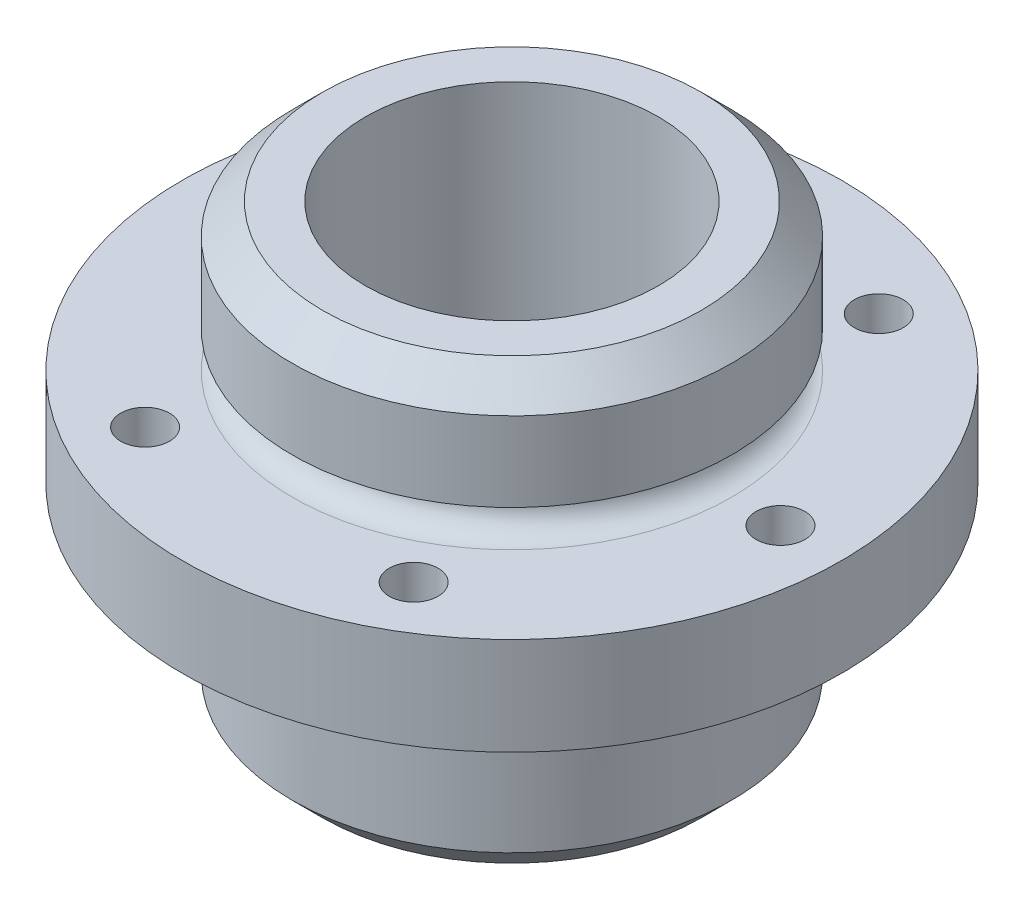
ISO-10303-21;
HEADER;
FILE_DESCRIPTION(('STEP AP214'),'2;1');
FILE_NAME('part.step','',(''),(''),'','','');
FILE_SCHEMA(('AUTOMOTIVE_DESIGN { 1 0 10303 214 1 1 1 1 }'));
ENDSEC;
DATA;
#1=APPLICATION_CONTEXT('core data for automotive mechanical design processes');
#2=APPLICATION_PROTOCOL_DEFINITION('international standard','automotive_design',2000,#1);
#3=PRODUCT_CONTEXT('',#1,'mechanical');
#4=PRODUCT('Part','Part','',(#3));
#5=PRODUCT_RELATED_PRODUCT_CATEGORY('part','',(#4));
#6=PRODUCT_DEFINITION_FORMATION('','',#4);
#7=PRODUCT_DEFINITION_CONTEXT('part definition',#1,'design');
#8=PRODUCT_DEFINITION('design','',#6,#7);
#9=PRODUCT_DEFINITION_SHAPE('','',#8);
#10=(LENGTH_UNIT() NAMED_UNIT(*) SI_UNIT(.MILLI.,.METRE.));
#11=(NAMED_UNIT(*) PLANE_ANGLE_UNIT() SI_UNIT($,.RADIAN.));
#12=(NAMED_UNIT(*) SI_UNIT($,.STERADIAN.) SOLID_ANGLE_UNIT());
#13=UNCERTAINTY_MEASURE_WITH_UNIT(LENGTH_MEASURE(1.E-05),#10,'distance_accuracy_value','');
#14=(GEOMETRIC_REPRESENTATION_CONTEXT(3) GLOBAL_UNCERTAINTY_ASSIGNED_CONTEXT((#13)) GLOBAL_UNIT_ASSIGNED_CONTEXT((#10,
#11,#12)) REPRESENTATION_CONTEXT('',''));
#15=CARTESIAN_POINT('',(0.,0.,0.));
#16=DIRECTION('',(0.,0.,1.));
#17=DIRECTION('',(1.,0.,0.));
#18=AXIS2_PLACEMENT_3D('',#15,#16,#17);
#19=CARTESIAN_POINT('',(0.,-8.39184523840261,0.));
#20=DIRECTION('',(0.,-1.,0.));
#21=DIRECTION('',(0.,0.,-1.));
#22=AXIS2_PLACEMENT_3D('',#19,#20,#21);
#23=TOROIDAL_SURFACE('',#22,35.3300603074002,4.);
#24=CARTESIAN_POINT('',(0.,-6.17583568312595,0.));
#25=DIRECTION('',(0.,-1.,0.));
#26=DIRECTION('',(0.,0.,-1.));
#27=AXIS2_PLACEMENT_3D('',#24,#25,#26);
#28=CIRCLE('',#27,32.);
#29=CARTESIAN_POINT('',(0.,-6.17583568312595,-32.));
#30=VERTEX_POINT('',#29);
#31=EDGE_CURVE('E93',#30,#30,#28,.T.);
#32=ORIENTED_EDGE('',*,*,#31,.T.);
#33=EDGE_LOOP('',(#32));
#34=FACE_BOUND('',#33,.T.);
#35=CARTESIAN_POINT('',(0.,-12.335343787696,0.));
#36=DIRECTION('',(0.,-1.,0.));
#37=DIRECTION('',(0.,0.,-1.));
#38=AXIS2_PLACEMENT_3D('',#35,#36,#37);
#39=CIRCLE('',#38,36.);
#40=CARTESIAN_POINT('',(0.,-12.335343787696,-36.));
#41=VERTEX_POINT('',#40);
#42=EDGE_CURVE('E69',#41,#41,#39,.T.);
#43=ORIENTED_EDGE('',*,*,#42,.F.);
#44=EDGE_LOOP('',(#43));
#45=FACE_BOUND('',#44,.T.);
#46=ADVANCED_FACE('F43',(#34,#45),#23,.F.);
#47=CARTESIAN_POINT('',(0.,0.,0.));
#48=DIRECTION('',(0.,-1.,0.));
#49=DIRECTION('',(0.,0.,-1.));
#50=AXIS2_PLACEMENT_3D('',#47,#48,#49);
#51=CYLINDRICAL_SURFACE('',#50,36.);
#52=CARTESIAN_POINT('',(0.,-31.335343787696,0.));
#53=DIRECTION('',(0.,1.,0.));
#54=DIRECTION('',(0.,0.,1.));
#55=AXIS2_PLACEMENT_3D('',#52,#53,#54);
#56=CIRCLE('',#55,36.);
#57=CARTESIAN_POINT('',(0.,-31.335343787696,36.));
#58=VERTEX_POINT('',#57);
#59=EDGE_CURVE('E63',#58,#58,#56,.T.);
#60=ORIENTED_EDGE('',*,*,#59,.T.);
#61=EDGE_LOOP('',(#60));
#62=FACE_BOUND('',#61,.T.);
#63=ORIENTED_EDGE('',*,*,#42,.T.);
#64=EDGE_LOOP('',(#63));
#65=FACE_BOUND('',#64,.T.);
#66=ADVANCED_FACE('F166',(#62,#65),#51,.T.);
#67=CARTESIAN_POINT('',(0.,-36.335343787696,0.));
#68=DIRECTION('',(0.,1.,0.));
#69=DIRECTION('',(0.,0.,1.));
#70=AXIS2_PLACEMENT_3D('',#67,#68,#69);
#71=PLANE('',#70);
#72=CARTESIAN_POINT('',(0.,-36.335343787696,0.));
#73=DIRECTION('',(0.,1.,0.));
#74=DIRECTION('',(0.,0.,1.));
#75=AXIS2_PLACEMENT_3D('',#72,#73,#74);
#76=CIRCLE('',#75,31.);
#77=CARTESIAN_POINT('',(0.,-36.335343787696,31.));
#78=VERTEX_POINT('',#77);
#79=EDGE_CURVE('E66',#78,#78,#76,.F.);
#80=ORIENTED_EDGE('',*,*,#79,.T.);
#81=EDGE_LOOP('',(#80));
#82=FACE_BOUND('',#81,.T.);
#83=CARTESIAN_POINT('',(0.,-36.335343787696,0.));
#84=DIRECTION('',(0.,-1.,0.));
#85=DIRECTION('',(0.,0.,-1.));
#86=AXIS2_PLACEMENT_3D('',#83,#84,#85);
#87=CIRCLE('',#86,24.);
#88=CARTESIAN_POINT('',(0.,-36.335343787696,-24.));
#89=VERTEX_POINT('',#88);
#90=EDGE_CURVE('E72',#89,#89,#87,.T.);
#91=ORIENTED_EDGE('',*,*,#90,.F.);
#92=EDGE_LOOP('',(#91));
#93=FACE_BOUND('',#92,.T.);
#94=ADVANCED_FACE('F172',(#82,#93),#71,.F.);
#95=CARTESIAN_POINT('',(0.,0.,0.));
#96=DIRECTION('',(0.,-1.,0.));
#97=DIRECTION('',(0.,0.,-1.));
#98=AXIS2_PLACEMENT_3D('',#95,#96,#97);
#99=CYLINDRICAL_SURFACE('',#98,24.);
#100=CARTESIAN_POINT('',(0.,35.664656212304,0.));
#101=DIRECTION('',(0.,-1.,0.));
#102=DIRECTION('',(0.,0.,-1.));
#103=AXIS2_PLACEMENT_3D('',#100,#101,#102);
#104=CIRCLE('',#103,24.);
#105=CARTESIAN_POINT('',(0.,35.664656212304,-24.));
#106=VERTEX_POINT('',#105);
#107=EDGE_CURVE('E75',#106,#106,#104,.T.);
#108=ORIENTED_EDGE('',*,*,#107,.F.);
#109=EDGE_LOOP('',(#108));
#110=FACE_BOUND('',#109,.T.);
#111=ORIENTED_EDGE('',*,*,#90,.T.);
#112=EDGE_LOOP('',(#111));
#113=FACE_BOUND('',#112,.T.);
#114=ADVANCED_FACE('F218',(#110,#113),#99,.F.);
#115=CARTESIAN_POINT('',(0.,35.664656212304,0.));
#116=DIRECTION('',(0.,-1.,0.));
#117=DIRECTION('',(0.,0.,-1.));
#118=AXIS2_PLACEMENT_3D('',#115,#116,#117);
#119=PLANE('',#118);
#120=CARTESIAN_POINT('',(0.,35.664656212304,0.));
#121=DIRECTION('',(0.,-1.,0.));
#122=DIRECTION('',(0.,0.,-1.));
#123=AXIS2_PLACEMENT_3D('',#120,#121,#122);
#124=CIRCLE('',#123,31.);
#125=CARTESIAN_POINT('',(0.,35.664656212304,-31.));
#126=VERTEX_POINT('',#125);
#127=EDGE_CURVE('E54',#126,#126,#124,.F.);
#128=ORIENTED_EDGE('',*,*,#127,.T.);
#129=EDGE_LOOP('',(#128));
#130=FACE_BOUND('',#129,.T.);
#131=ORIENTED_EDGE('',*,*,#107,.T.);
#132=EDGE_LOOP('',(#131));
#133=FACE_BOUND('',#132,.T.);
#134=ADVANCED_FACE('F203',(#130,#133),#119,.F.);
#135=CARTESIAN_POINT('',(0.,0.,0.));
#136=DIRECTION('',(0.,-1.,0.));
#137=DIRECTION('',(0.,0.,-1.));
#138=AXIS2_PLACEMENT_3D('',#135,#136,#137);
#139=CYLINDRICAL_SURFACE('',#138,36.);
#140=CARTESIAN_POINT('',(0.,30.664656212304,0.));
#141=DIRECTION('',(0.,-1.,0.));
#142=DIRECTION('',(0.,0.,-1.));
#143=AXIS2_PLACEMENT_3D('',#140,#141,#142);
#144=CIRCLE('',#143,36.);
#145=CARTESIAN_POINT('',(0.,30.664656212304,-36.));
#146=VERTEX_POINT('',#145);
#147=EDGE_CURVE('E58',#146,#146,#144,.T.);
#148=ORIENTED_EDGE('',*,*,#147,.T.);
#149=EDGE_LOOP('',(#148));
#150=FACE_BOUND('',#149,.T.);
#151=CARTESIAN_POINT('',(0.,17.664656212304,0.));
#152=DIRECTION('',(0.,-1.,0.));
#153=DIRECTION('',(0.,0.,-1.));
#154=AXIS2_PLACEMENT_3D('',#151,#152,#153);
#155=CIRCLE('',#154,36.);
#156=CARTESIAN_POINT('',(0.,17.664656212304,-36.));
#157=VERTEX_POINT('',#156);
#158=EDGE_CURVE('E78',#157,#157,#155,.T.);
#159=ORIENTED_EDGE('',*,*,#158,.F.);
#160=EDGE_LOOP('',(#159));
#161=FACE_BOUND('',#160,.T.);
#162=ADVANCED_FACE('F199',(#150,#161),#139,.T.);
#163=CARTESIAN_POINT('',(0.,17.664656212304,0.));
#164=DIRECTION('',(0.,1.,0.));
#165=DIRECTION('',(0.,0.,1.));
#166=AXIS2_PLACEMENT_3D('',#163,#164,#165);
#167=PLANE('',#166);
#168=CARTESIAN_POINT('',(0.,17.664656212304,0.));
#169=DIRECTION('',(0.,-1.,0.));
#170=DIRECTION('',(0.,0.,-1.));
#171=AXIS2_PLACEMENT_3D('',#168,#169,#170);
#172=CIRCLE('',#171,32.);
#173=CARTESIAN_POINT('',(0.,17.664656212304,-32.));
#174=VERTEX_POINT('',#173);
#175=EDGE_CURVE('E81',#174,#174,#172,.T.);
#176=ORIENTED_EDGE('',*,*,#175,.F.);
#177=EDGE_LOOP('',(#176));
#178=FACE_BOUND('',#177,.T.);
#179=ORIENTED_EDGE('',*,*,#158,.T.);
#180=EDGE_LOOP('',(#179));
#181=FACE_BOUND('',#180,.T.);
#182=ADVANCED_FACE('F202',(#178,#181),#167,.F.);
#183=CARTESIAN_POINT('',(0.,0.,0.));
#184=DIRECTION('',(0.,-1.,0.));
#185=DIRECTION('',(0.,0.,-1.));
#186=AXIS2_PLACEMENT_3D('',#183,#184,#185);
#187=CYLINDRICAL_SURFACE('',#186,32.);
#188=CARTESIAN_POINT('',(0.,15.664656212304,0.));
#189=DIRECTION('',(0.,-1.,0.));
#190=DIRECTION('',(0.,0.,-1.));
#191=AXIS2_PLACEMENT_3D('',#188,#189,#190);
#192=CIRCLE('',#191,32.);
#193=CARTESIAN_POINT('',(0.,15.664656212304,-32.));
#194=VERTEX_POINT('',#193);
#195=EDGE_CURVE('E10',#194,#194,#192,.F.);
#196=ORIENTED_EDGE('',*,*,#195,.T.);
#197=EDGE_LOOP('',(#196));
#198=FACE_BOUND('',#197,.T.);
#199=ORIENTED_EDGE('',*,*,#175,.T.);
#200=EDGE_LOOP('',(#199));
#201=FACE_BOUND('',#200,.T.);
#202=ADVANCED_FACE('F140',(#198,#201),#187,.T.);
#203=CARTESIAN_POINT('',(0.,11.664656212304,0.));
#204=DIRECTION('',(0.,-1.,0.));
#205=DIRECTION('',(0.,0.,-1.));
#206=AXIS2_PLACEMENT_3D('',#203,#204,#205);
#207=PLANE('',#206);
#208=CARTESIAN_POINT('',(44.,11.664656212304,0.));
#209=DIRECTION('',(0.,1.,0.));
#210=DIRECTION('',(0.,0.,1.));
#211=AXIS2_PLACEMENT_3D('',#208,#209,#210);
#212=CIRCLE('',#211,4.);
#213=CARTESIAN_POINT('',(44.,11.664656212304,4.));
#214=VERTEX_POINT('',#213);
#215=EDGE_CURVE('E120',#214,#214,#212,.T.);
#216=ORIENTED_EDGE('',*,*,#215,.F.);
#217=EDGE_LOOP('',(#216));
#218=FACE_BOUND('',#217,.T.);
#219=CARTESIAN_POINT('',(22.0000000000004,11.664656212304,-38.105117766515));
#220=DIRECTION('',(0.,1.,0.));
#221=DIRECTION('',(0.,0.,1.));
#222=AXIS2_PLACEMENT_3D('',#219,#220,#221);
#223=CIRCLE('',#222,4.00000000000001);
#224=CARTESIAN_POINT('',(22.0000000000004,11.664656212304,-34.105117766515));
#225=VERTEX_POINT('',#224);
#226=EDGE_CURVE('E104',#225,#225,#223,.T.);
#227=ORIENTED_EDGE('',*,*,#226,.F.);
#228=EDGE_LOOP('',(#227));
#229=FACE_BOUND('',#228,.T.);
#230=CARTESIAN_POINT('',(-21.9999999999996,11.664656212304,-38.1051177665155));
#231=DIRECTION('',(0.,1.,0.));
#232=DIRECTION('',(0.,0.,1.));
#233=AXIS2_PLACEMENT_3D('',#230,#231,#232);
#234=CIRCLE('',#233,4.);
#235=CARTESIAN_POINT('',(-21.9999999999996,11.664656212304,-34.1051177665155));
#236=VERTEX_POINT('',#235);
#237=EDGE_CURVE('E97',#236,#236,#234,.T.);
#238=ORIENTED_EDGE('',*,*,#237,.F.);
#239=EDGE_LOOP('',(#238));
#240=FACE_BOUND('',#239,.T.);
#241=CARTESIAN_POINT('',(-44.,11.664656212304,-3.07250357818196E-13));
#242=DIRECTION('',(0.,1.,0.));
#243=DIRECTION('',(0.,0.,1.));
#244=AXIS2_PLACEMENT_3D('',#241,#242,#243);
#245=CIRCLE('',#244,4.);
#246=CARTESIAN_POINT('',(-44.,11.664656212304,3.99999999999969));
#247=VERTEX_POINT('',#246);
#248=EDGE_CURVE('E105',#247,#247,#245,.T.);
#249=ORIENTED_EDGE('',*,*,#248,.F.);
#250=EDGE_LOOP('',(#249));
#251=FACE_BOUND('',#250,.T.);
#252=CARTESIAN_POINT('',(-22.0000000000002,11.664656212304,38.1051177665152));
#253=DIRECTION('',(0.,1.,0.));
#254=DIRECTION('',(0.,0.,1.));
#255=AXIS2_PLACEMENT_3D('',#252,#253,#254);
#256=CIRCLE('',#255,4.);
#257=CARTESIAN_POINT('',(-22.0000000000002,11.664656212304,42.1051177665152));
#258=VERTEX_POINT('',#257);
#259=EDGE_CURVE('E111',#258,#258,#256,.T.);
#260=ORIENTED_EDGE('',*,*,#259,.F.);
#261=EDGE_LOOP('',(#260));
#262=FACE_BOUND('',#261,.T.);
#263=CARTESIAN_POINT('',(21.9999999999999,11.664656212304,38.1051177665153));
#264=DIRECTION('',(0.,1.,0.));
#265=DIRECTION('',(0.,0.,1.));
#266=AXIS2_PLACEMENT_3D('',#263,#264,#265);
#267=CIRCLE('',#266,4.);
#268=CARTESIAN_POINT('',(21.9999999999999,11.664656212304,42.1051177665153));
#269=VERTEX_POINT('',#268);
#270=EDGE_CURVE('E117',#269,#269,#267,.T.);
#271=ORIENTED_EDGE('',*,*,#270,.F.);
#272=EDGE_LOOP('',(#271));
#273=FACE_BOUND('',#272,.T.);
#274=CARTESIAN_POINT('',(0.,11.664656212304,0.));
#275=DIRECTION('',(0.,-1.,0.));
#276=DIRECTION('',(0.,0.,-1.));
#277=AXIS2_PLACEMENT_3D('',#274,#275,#276);
#278=CIRCLE('',#277,36.);
#279=CARTESIAN_POINT('',(0.,11.664656212304,-36.));
#280=VERTEX_POINT('',#279);
#281=EDGE_CURVE('E50',#280,#280,#278,.T.);
#282=ORIENTED_EDGE('',*,*,#281,.T.);
#283=EDGE_LOOP('',(#282));
#284=FACE_BOUND('',#283,.T.);
#285=CARTESIAN_POINT('',(0.,11.664656212304,0.));
#286=DIRECTION('',(0.,-1.,0.));
#287=DIRECTION('',(0.,0.,-1.));
#288=AXIS2_PLACEMENT_3D('',#285,#286,#287);
#289=CIRCLE('',#288,54.);
#290=CARTESIAN_POINT('',(0.,11.664656212304,-54.));
#291=VERTEX_POINT('',#290);
#292=EDGE_CURVE('E84',#291,#291,#289,.T.);
#293=ORIENTED_EDGE('',*,*,#292,.F.);
#294=EDGE_LOOP('',(#293));
#295=FACE_BOUND('',#294,.T.);
#296=ADVANCED_FACE('F136',(#218,#229,#240,#251,#262,#273,#284,#295),#207,.F.);
#297=CARTESIAN_POINT('',(0.,0.,0.));
#298=DIRECTION('',(0.,-1.,0.));
#299=DIRECTION('',(0.,0.,-1.));
#300=AXIS2_PLACEMENT_3D('',#297,#298,#299);
#301=CYLINDRICAL_SURFACE('',#300,54.);
#302=CARTESIAN_POINT('',(0.,-4.33534378769603,0.));
#303=DIRECTION('',(0.,-1.,0.));
#304=DIRECTION('',(0.,0.,-1.));
#305=AXIS2_PLACEMENT_3D('',#302,#303,#304);
#306=CIRCLE('',#305,54.);
#307=CARTESIAN_POINT('',(0.,-4.33534378769603,-54.));
#308=VERTEX_POINT('',#307);
#309=EDGE_CURVE('E87',#308,#308,#306,.T.);
#310=ORIENTED_EDGE('',*,*,#309,.F.);
#311=EDGE_LOOP('',(#310));
#312=FACE_BOUND('',#311,.T.);
#313=ORIENTED_EDGE('',*,*,#292,.T.);
#314=EDGE_LOOP('',(#313));
#315=FACE_BOUND('',#314,.T.);
#316=ADVANCED_FACE('F139',(#312,#315),#301,.T.);
#317=CARTESIAN_POINT('',(0.,-4.33534378769603,0.));
#318=DIRECTION('',(0.,1.,0.));
#319=DIRECTION('',(0.,0.,1.));
#320=AXIS2_PLACEMENT_3D('',#317,#318,#319);
#321=PLANE('',#320);
#322=CARTESIAN_POINT('',(44.,-4.33534378769603,0.));
#323=DIRECTION('',(0.,1.,0.));
#324=DIRECTION('',(0.,0.,1.));
#325=AXIS2_PLACEMENT_3D('',#322,#323,#324);
#326=CIRCLE('',#325,4.);
#327=CARTESIAN_POINT('',(44.,-4.33534378769603,4.));
#328=VERTEX_POINT('',#327);
#329=EDGE_CURVE('E96',#328,#328,#326,.F.);
#330=ORIENTED_EDGE('',*,*,#329,.F.);
#331=EDGE_LOOP('',(#330));
#332=FACE_BOUND('',#331,.T.);
#333=CARTESIAN_POINT('',(22.0000000000004,-4.33534378769603,-38.105117766515));
#334=DIRECTION('',(0.,1.,0.));
#335=DIRECTION('',(0.,0.,1.));
#336=AXIS2_PLACEMENT_3D('',#333,#334,#335);
#337=CIRCLE('',#336,4.00000000000001);
#338=CARTESIAN_POINT('',(22.0000000000004,-4.33534378769603,-34.105117766515));
#339=VERTEX_POINT('',#338);
#340=EDGE_CURVE('E125',#339,#339,#337,.F.);
#341=ORIENTED_EDGE('',*,*,#340,.F.);
#342=EDGE_LOOP('',(#341));
#343=FACE_BOUND('',#342,.T.);
#344=CARTESIAN_POINT('',(-21.9999999999996,-4.33534378769603,-38.1051177665155));
#345=DIRECTION('',(0.,1.,0.));
#346=DIRECTION('',(0.,0.,1.));
#347=AXIS2_PLACEMENT_3D('',#344,#345,#346);
#348=CIRCLE('',#347,4.);
#349=CARTESIAN_POINT('',(-21.9999999999996,-4.33534378769603,-34.1051177665155));
#350=VERTEX_POINT('',#349);
#351=EDGE_CURVE('E101',#350,#350,#348,.F.);
#352=ORIENTED_EDGE('',*,*,#351,.F.);
#353=EDGE_LOOP('',(#352));
#354=FACE_BOUND('',#353,.T.);
#355=CARTESIAN_POINT('',(-44.,-4.33534378769603,-3.07250357818196E-13));
#356=DIRECTION('',(0.,1.,0.));
#357=DIRECTION('',(0.,0.,1.));
#358=AXIS2_PLACEMENT_3D('',#355,#356,#357);
#359=CIRCLE('',#358,4.);
#360=CARTESIAN_POINT('',(-44.,-4.33534378769603,3.99999999999969));
#361=VERTEX_POINT('',#360);
#362=EDGE_CURVE('E100',#361,#361,#359,.F.);
#363=ORIENTED_EDGE('',*,*,#362,.F.);
#364=EDGE_LOOP('',(#363));
#365=FACE_BOUND('',#364,.T.);
#366=CARTESIAN_POINT('',(-22.0000000000002,-4.33534378769603,38.1051177665152));
#367=DIRECTION('',(0.,1.,0.));
#368=DIRECTION('',(0.,0.,1.));
#369=AXIS2_PLACEMENT_3D('',#366,#367,#368);
#370=CIRCLE('',#369,4.);
#371=CARTESIAN_POINT('',(-22.0000000000002,-4.33534378769603,42.1051177665152));
#372=VERTEX_POINT('',#371);
#373=EDGE_CURVE('E108',#372,#372,#370,.F.);
#374=ORIENTED_EDGE('',*,*,#373,.F.);
#375=EDGE_LOOP('',(#374));
#376=FACE_BOUND('',#375,.T.);
#377=CARTESIAN_POINT('',(21.9999999999999,-4.33534378769603,38.1051177665153));
#378=DIRECTION('',(0.,1.,0.));
#379=DIRECTION('',(0.,0.,1.));
#380=AXIS2_PLACEMENT_3D('',#377,#378,#379);
#381=CIRCLE('',#380,4.);
#382=CARTESIAN_POINT('',(21.9999999999999,-4.33534378769603,42.1051177665153));
#383=VERTEX_POINT('',#382);
#384=EDGE_CURVE('E114',#383,#383,#381,.F.);
#385=ORIENTED_EDGE('',*,*,#384,.F.);
#386=EDGE_LOOP('',(#385));
#387=FACE_BOUND('',#386,.T.);
#388=CARTESIAN_POINT('',(0.,-4.33534378769603,0.));
#389=DIRECTION('',(0.,-1.,0.));
#390=DIRECTION('',(0.,0.,-1.));
#391=AXIS2_PLACEMENT_3D('',#388,#389,#390);
#392=CIRCLE('',#391,32.);
#393=CARTESIAN_POINT('',(0.,-4.33534378769603,-32.));
#394=VERTEX_POINT('',#393);
#395=EDGE_CURVE('E90',#394,#394,#392,.T.);
#396=ORIENTED_EDGE('',*,*,#395,.F.);
#397=EDGE_LOOP('',(#396));
#398=FACE_BOUND('',#397,.T.);
#399=ORIENTED_EDGE('',*,*,#309,.T.);
#400=EDGE_LOOP('',(#399));
#401=FACE_BOUND('',#400,.T.);
#402=ADVANCED_FACE('F155',(#332,#343,#354,#365,#376,#387,#398,#401),#321,.F.);
#403=CARTESIAN_POINT('',(0.,0.,0.));
#404=DIRECTION('',(0.,-1.,0.));
#405=DIRECTION('',(0.,0.,-1.));
#406=AXIS2_PLACEMENT_3D('',#403,#404,#405);
#407=CYLINDRICAL_SURFACE('',#406,32.);
#408=ORIENTED_EDGE('',*,*,#31,.F.);
#409=EDGE_LOOP('',(#408));
#410=FACE_BOUND('',#409,.T.);
#411=ORIENTED_EDGE('',*,*,#395,.T.);
#412=EDGE_LOOP('',(#411));
#413=FACE_BOUND('',#412,.T.);
#414=ADVANCED_FACE('F161',(#410,#413),#407,.T.);
#415=CARTESIAN_POINT('',(0.,-36.335343787696,0.));
#416=DIRECTION('',(0.,1.,0.));
#417=DIRECTION('',(0.,0.,1.));
#418=AXIS2_PLACEMENT_3D('',#415,#416,#417);
#419=CONICAL_SURFACE('',#418,31.,0.785398163397446);
#420=ORIENTED_EDGE('',*,*,#59,.F.);
#421=EDGE_LOOP('',(#420));
#422=FACE_BOUND('',#421,.T.);
#423=ORIENTED_EDGE('',*,*,#79,.F.);
#424=EDGE_LOOP('',(#423));
#425=FACE_BOUND('',#424,.T.);
#426=ADVANCED_FACE('F179',(#422,#425),#419,.T.);
#427=CARTESIAN_POINT('',(0.,30.664656212304,0.));
#428=DIRECTION('',(0.,-1.,0.));
#429=DIRECTION('',(0.,0.,-1.));
#430=AXIS2_PLACEMENT_3D('',#427,#428,#429);
#431=CONICAL_SURFACE('',#430,36.,0.78539816339745);
#432=ORIENTED_EDGE('',*,*,#127,.F.);
#433=EDGE_LOOP('',(#432));
#434=FACE_BOUND('',#433,.T.);
#435=ORIENTED_EDGE('',*,*,#147,.F.);
#436=EDGE_LOOP('',(#435));
#437=FACE_BOUND('',#436,.T.);
#438=ADVANCED_FACE('F184',(#434,#437),#431,.T.);
#439=CARTESIAN_POINT('',(0.,15.664656212304,0.));
#440=DIRECTION('',(0.,-1.,0.));
#441=DIRECTION('',(0.,0.,-1.));
#442=AXIS2_PLACEMENT_3D('',#439,#440,#441);
#443=TOROIDAL_SURFACE('',#442,36.,4.);
#444=ORIENTED_EDGE('',*,*,#195,.F.);
#445=EDGE_LOOP('',(#444));
#446=FACE_BOUND('',#445,.T.);
#447=ORIENTED_EDGE('',*,*,#281,.F.);
#448=EDGE_LOOP('',(#447));
#449=FACE_BOUND('',#448,.T.);
#450=ADVANCED_FACE('F45',(#446,#449),#443,.F.);
#451=CARTESIAN_POINT('',(21.9999999999999,-36.336343787696,38.1051177665153));
#452=DIRECTION('',(0.,1.,0.));
#453=DIRECTION('',(0.,0.,1.));
#454=AXIS2_PLACEMENT_3D('',#451,#452,#453);
#455=CYLINDRICAL_SURFACE('',#454,4.);
#456=ORIENTED_EDGE('',*,*,#270,.T.);
#457=EDGE_LOOP('',(#456));
#458=FACE_BOUND('',#457,.T.);
#459=ORIENTED_EDGE('',*,*,#384,.T.);
#460=EDGE_LOOP('',(#459));
#461=FACE_BOUND('',#460,.T.);
#462=ADVANCED_FACE('F193',(#458,#461),#455,.F.);
#463=CARTESIAN_POINT('',(-22.0000000000002,-36.336343787696,38.1051177665152));
#464=DIRECTION('',(0.,1.,0.));
#465=DIRECTION('',(0.,0.,1.));
#466=AXIS2_PLACEMENT_3D('',#463,#464,#465);
#467=CYLINDRICAL_SURFACE('',#466,4.);
#468=ORIENTED_EDGE('',*,*,#259,.T.);
#469=EDGE_LOOP('',(#468));
#470=FACE_BOUND('',#469,.T.);
#471=ORIENTED_EDGE('',*,*,#373,.T.);
#472=EDGE_LOOP('',(#471));
#473=FACE_BOUND('',#472,.T.);
#474=ADVANCED_FACE('F299',(#470,#473),#467,.F.);
#475=CARTESIAN_POINT('',(-44.,-36.336343787696,-3.07250357818196E-13));
#476=DIRECTION('',(0.,1.,0.));
#477=DIRECTION('',(0.,0.,1.));
#478=AXIS2_PLACEMENT_3D('',#475,#476,#477);
#479=CYLINDRICAL_SURFACE('',#478,4.);
#480=ORIENTED_EDGE('',*,*,#248,.T.);
#481=EDGE_LOOP('',(#480));
#482=FACE_BOUND('',#481,.T.);
#483=ORIENTED_EDGE('',*,*,#362,.T.);
#484=EDGE_LOOP('',(#483));
#485=FACE_BOUND('',#484,.T.);
#486=ADVANCED_FACE('F310',(#482,#485),#479,.F.);
#487=CARTESIAN_POINT('',(-21.9999999999996,-36.336343787696,-38.1051177665155));
#488=DIRECTION('',(0.,1.,0.));
#489=DIRECTION('',(0.,0.,1.));
#490=AXIS2_PLACEMENT_3D('',#487,#488,#489);
#491=CYLINDRICAL_SURFACE('',#490,4.);
#492=ORIENTED_EDGE('',*,*,#237,.T.);
#493=EDGE_LOOP('',(#492));
#494=FACE_BOUND('',#493,.T.);
#495=ORIENTED_EDGE('',*,*,#351,.T.);
#496=EDGE_LOOP('',(#495));
#497=FACE_BOUND('',#496,.T.);
#498=ADVANCED_FACE('F321',(#494,#497),#491,.F.);
#499=CARTESIAN_POINT('',(22.0000000000004,-36.336343787696,-38.105117766515));
#500=DIRECTION('',(0.,1.,0.));
#501=DIRECTION('',(0.,0.,1.));
#502=AXIS2_PLACEMENT_3D('',#499,#500,#501);
#503=CYLINDRICAL_SURFACE('',#502,4.00000000000001);
#504=ORIENTED_EDGE('',*,*,#226,.T.);
#505=EDGE_LOOP('',(#504));
#506=FACE_BOUND('',#505,.T.);
#507=ORIENTED_EDGE('',*,*,#340,.T.);
#508=EDGE_LOOP('',(#507));
#509=FACE_BOUND('',#508,.T.);
#510=ADVANCED_FACE('F332',(#506,#509),#503,.F.);
#511=CARTESIAN_POINT('',(44.,-36.336343787696,0.));
#512=DIRECTION('',(0.,1.,0.));
#513=DIRECTION('',(0.,0.,1.));
#514=AXIS2_PLACEMENT_3D('',#511,#512,#513);
#515=CYLINDRICAL_SURFACE('',#514,4.);
#516=ORIENTED_EDGE('',*,*,#215,.T.);
#517=EDGE_LOOP('',(#516));
#518=FACE_BOUND('',#517,.T.);
#519=ORIENTED_EDGE('',*,*,#329,.T.);
#520=EDGE_LOOP('',(#519));
#521=FACE_BOUND('',#520,.T.);
#522=ADVANCED_FACE('F133',(#518,#521),#515,.F.);
#523=CLOSED_SHELL('',(#46,#66,#94,#114,#134,#162,#182,#202,#296,#316,#402,#414,#426,#438,#450,
#462,#474,#486,#498,#510,#522));
#524=MANIFOLD_SOLID_BREP('B2',#523);
#525=ADVANCED_BREP_SHAPE_REPRESENTATION('',(#18,#524),#14);
#526=SHAPE_DEFINITION_REPRESENTATION(#9,#525);
ENDSEC;
END-ISO-10303-21;
